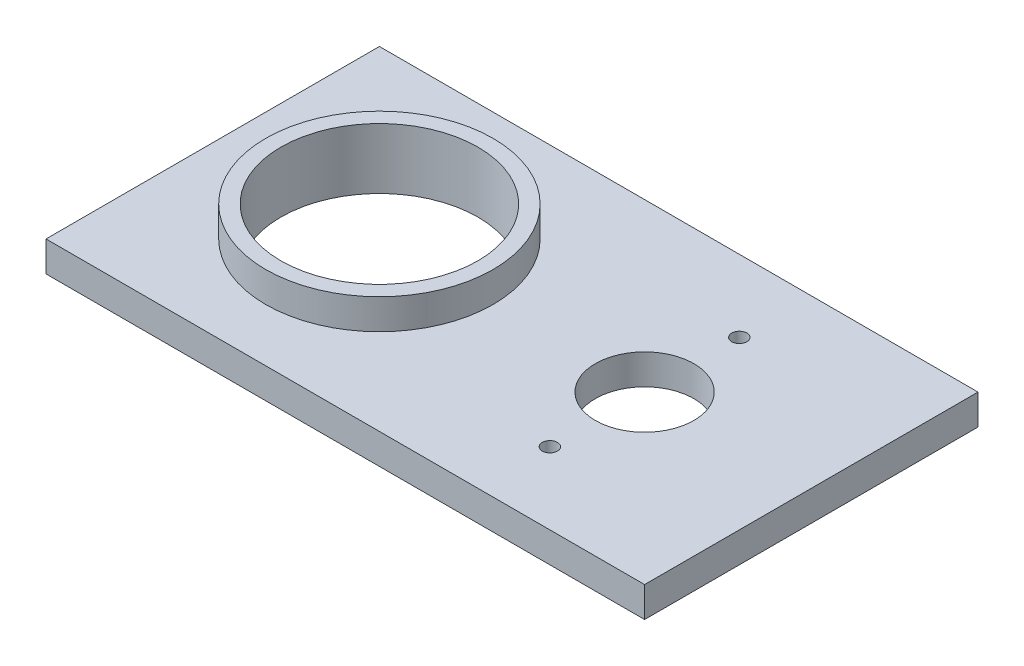
ISO-10303-21;
HEADER;
FILE_DESCRIPTION(('STEP AP214'),'2;1');
FILE_NAME('part.step','',(''),(''),'','','');
FILE_SCHEMA(('AUTOMOTIVE_DESIGN { 1 0 10303 214 1 1 1 1 }'));
ENDSEC;
DATA;
#1=APPLICATION_CONTEXT('core data for automotive mechanical design processes');
#2=APPLICATION_PROTOCOL_DEFINITION('international standard','automotive_design',2000,#1);
#3=PRODUCT_CONTEXT('',#1,'mechanical');
#4=PRODUCT('Part','Part','',(#3));
#5=PRODUCT_RELATED_PRODUCT_CATEGORY('part','',(#4));
#6=PRODUCT_DEFINITION_FORMATION('','',#4);
#7=PRODUCT_DEFINITION_CONTEXT('part definition',#1,'design');
#8=PRODUCT_DEFINITION('design','',#6,#7);
#9=PRODUCT_DEFINITION_SHAPE('','',#8);
#10=(LENGTH_UNIT() NAMED_UNIT(*) SI_UNIT(.MILLI.,.METRE.));
#11=(NAMED_UNIT(*) PLANE_ANGLE_UNIT() SI_UNIT($,.RADIAN.));
#12=(NAMED_UNIT(*) SI_UNIT($,.STERADIAN.) SOLID_ANGLE_UNIT());
#13=UNCERTAINTY_MEASURE_WITH_UNIT(LENGTH_MEASURE(1.E-05),#10,'distance_accuracy_value','');
#14=(GEOMETRIC_REPRESENTATION_CONTEXT(3) GLOBAL_UNCERTAINTY_ASSIGNED_CONTEXT((#13)) GLOBAL_UNIT_ASSIGNED_CONTEXT((#10,
#11,#12)) REPRESENTATION_CONTEXT('',''));
#15=CARTESIAN_POINT('',(0.,0.,0.));
#16=DIRECTION('',(0.,0.,1.));
#17=DIRECTION('',(1.,0.,0.));
#18=AXIS2_PLACEMENT_3D('',#15,#16,#17);
#19=CARTESIAN_POINT('',(0.,4.,0.));
#20=DIRECTION('',(0.,-1.,0.));
#21=DIRECTION('',(0.,0.,-1.));
#22=AXIS2_PLACEMENT_3D('',#19,#20,#21);
#23=PLANE('',#22);
#24=CARTESIAN_POINT('',(0.,4.,12.5));
#25=DIRECTION('',(0.,1.,0.));
#26=DIRECTION('',(0.,0.,1.));
#27=AXIS2_PLACEMENT_3D('',#24,#25,#26);
#28=CIRCLE('',#27,1.);
#29=CARTESIAN_POINT('',(0.,4.,13.5));
#30=VERTEX_POINT('',#29);
#31=EDGE_CURVE('E134',#30,#30,#28,.T.);
#32=ORIENTED_EDGE('',*,*,#31,.F.);
#33=EDGE_LOOP('',(#32));
#34=FACE_BOUND('',#33,.T.);
#35=CARTESIAN_POINT('',(0.,4.,-12.5));
#36=DIRECTION('',(0.,1.,0.));
#37=DIRECTION('',(0.,0.,1.));
#38=AXIS2_PLACEMENT_3D('',#35,#36,#37);
#39=CIRCLE('',#38,1.);
#40=CARTESIAN_POINT('',(0.,4.,-11.5));
#41=VERTEX_POINT('',#40);
#42=EDGE_CURVE('E143',#41,#41,#39,.T.);
#43=ORIENTED_EDGE('',*,*,#42,.F.);
#44=EDGE_LOOP('',(#43));
#45=FACE_BOUND('',#44,.T.);
#46=CARTESIAN_POINT('',(0.,4.,0.));
#47=DIRECTION('',(0.,1.,0.));
#48=DIRECTION('',(0.,0.,1.));
#49=AXIS2_PLACEMENT_3D('',#46,#47,#48);
#50=CIRCLE('',#49,6.5);
#51=CARTESIAN_POINT('',(0.,4.,6.5));
#52=VERTEX_POINT('',#51);
#53=EDGE_CURVE('E109',#52,#52,#50,.T.);
#54=ORIENTED_EDGE('',*,*,#53,.F.);
#55=EDGE_LOOP('',(#54));
#56=FACE_BOUND('',#55,.T.);
#57=DIRECTION('',(0.,0.,-1.));
#58=VECTOR('',#57,1.);
#59=CARTESIAN_POINT('',(22.,4.,22.));
#60=LINE('',#59,#58);
#61=CARTESIAN_POINT('',(22.,4.,22.));
#62=VERTEX_POINT('',#61);
#63=CARTESIAN_POINT('',(22.,4.,-22.));
#64=VERTEX_POINT('',#63);
#65=EDGE_CURVE('E92',#62,#64,#60,.T.);
#66=ORIENTED_EDGE('',*,*,#65,.T.);
#67=DIRECTION('',(-1.,0.,0.));
#68=VECTOR('',#67,1.);
#69=CARTESIAN_POINT('',(-57.,4.,-22.));
#70=LINE('',#69,#68);
#71=CARTESIAN_POINT('',(-57.,4.,-22.));
#72=VERTEX_POINT('',#71);
#73=EDGE_CURVE('E87',#64,#72,#70,.T.);
#74=ORIENTED_EDGE('',*,*,#73,.T.);
#75=DIRECTION('',(0.,0.,1.));
#76=VECTOR('',#75,1.);
#77=CARTESIAN_POINT('',(-57.,4.,22.));
#78=LINE('',#77,#76);
#79=CARTESIAN_POINT('',(-57.,4.,22.));
#80=VERTEX_POINT('',#79);
#81=EDGE_CURVE('E90',#72,#80,#78,.T.);
#82=ORIENTED_EDGE('',*,*,#81,.T.);
#83=DIRECTION('',(1.,0.,0.));
#84=VECTOR('',#83,1.);
#85=CARTESIAN_POINT('',(-57.,4.,22.));
#86=LINE('',#85,#84);
#87=EDGE_CURVE('E56',#80,#62,#86,.T.);
#88=ORIENTED_EDGE('',*,*,#87,.T.);
#89=EDGE_LOOP('',(#66,#74,#82,#88));
#90=FACE_BOUND('',#89,.T.);
#91=CARTESIAN_POINT('',(-35.,4.,0.));
#92=DIRECTION('',(0.,-1.,0.));
#93=DIRECTION('',(0.,0.,-1.));
#94=AXIS2_PLACEMENT_3D('',#91,#92,#93);
#95=CIRCLE('',#94,15.);
#96=CARTESIAN_POINT('',(-35.,4.,-15.));
#97=VERTEX_POINT('',#96);
#98=EDGE_CURVE('E11',#97,#97,#95,.F.);
#99=ORIENTED_EDGE('',*,*,#98,.F.);
#100=EDGE_LOOP('',(#99));
#101=FACE_BOUND('',#100,.T.);
#102=ADVANCED_FACE('F39',(#34,#45,#56,#90,#101),#23,.F.);
#103=CARTESIAN_POINT('',(0.,0.,0.));
#104=DIRECTION('',(0.,-1.,0.));
#105=DIRECTION('',(0.,0.,-1.));
#106=AXIS2_PLACEMENT_3D('',#103,#104,#105);
#107=PLANE('',#106);
#108=CARTESIAN_POINT('',(0.,0.,12.5));
#109=DIRECTION('',(0.,1.,0.));
#110=DIRECTION('',(0.,0.,1.));
#111=AXIS2_PLACEMENT_3D('',#108,#109,#110);
#112=CIRCLE('',#111,1.);
#113=CARTESIAN_POINT('',(0.,0.,13.5));
#114=VERTEX_POINT('',#113);
#115=EDGE_CURVE('E130',#114,#114,#112,.T.);
#116=ORIENTED_EDGE('',*,*,#115,.T.);
#117=EDGE_LOOP('',(#116));
#118=FACE_BOUND('',#117,.T.);
#119=CARTESIAN_POINT('',(0.,0.,0.));
#120=DIRECTION('',(0.,1.,0.));
#121=DIRECTION('',(0.,0.,1.));
#122=AXIS2_PLACEMENT_3D('',#119,#120,#121);
#123=CIRCLE('',#122,6.5);
#124=CARTESIAN_POINT('',(0.,0.,6.5));
#125=VERTEX_POINT('',#124);
#126=EDGE_CURVE('E146',#125,#125,#123,.T.);
#127=ORIENTED_EDGE('',*,*,#126,.T.);
#128=EDGE_LOOP('',(#127));
#129=FACE_BOUND('',#128,.T.);
#130=DIRECTION('',(0.,0.,-1.));
#131=VECTOR('',#130,1.);
#132=CARTESIAN_POINT('',(22.,0.,22.));
#133=LINE('',#132,#131);
#134=CARTESIAN_POINT('',(22.,0.,22.));
#135=VERTEX_POINT('',#134);
#136=CARTESIAN_POINT('',(22.,0.,-22.));
#137=VERTEX_POINT('',#136);
#138=EDGE_CURVE('E106',#135,#137,#133,.T.);
#139=ORIENTED_EDGE('',*,*,#138,.F.);
#140=DIRECTION('',(1.,0.,0.));
#141=VECTOR('',#140,1.);
#142=CARTESIAN_POINT('',(-57.,0.,22.));
#143=LINE('',#142,#141);
#144=CARTESIAN_POINT('',(-57.,0.,22.));
#145=VERTEX_POINT('',#144);
#146=EDGE_CURVE('E79',#145,#135,#143,.T.);
#147=ORIENTED_EDGE('',*,*,#146,.F.);
#148=DIRECTION('',(0.,0.,1.));
#149=VECTOR('',#148,1.);
#150=CARTESIAN_POINT('',(-57.,0.,22.));
#151=LINE('',#150,#149);
#152=CARTESIAN_POINT('',(-57.,0.,-22.));
#153=VERTEX_POINT('',#152);
#154=EDGE_CURVE('E73',#153,#145,#151,.T.);
#155=ORIENTED_EDGE('',*,*,#154,.F.);
#156=DIRECTION('',(-1.,0.,0.));
#157=VECTOR('',#156,1.);
#158=CARTESIAN_POINT('',(-57.,0.,-22.));
#159=LINE('',#158,#157);
#160=EDGE_CURVE('E97',#137,#153,#159,.T.);
#161=ORIENTED_EDGE('',*,*,#160,.F.);
#162=EDGE_LOOP('',(#139,#147,#155,#161));
#163=FACE_BOUND('',#162,.T.);
#164=CARTESIAN_POINT('',(0.,0.,-12.5));
#165=DIRECTION('',(0.,1.,0.));
#166=DIRECTION('',(0.,0.,1.));
#167=AXIS2_PLACEMENT_3D('',#164,#165,#166);
#168=CIRCLE('',#167,1.);
#169=CARTESIAN_POINT('',(0.,0.,-11.5));
#170=VERTEX_POINT('',#169);
#171=EDGE_CURVE('E125',#170,#170,#168,.T.);
#172=ORIENTED_EDGE('',*,*,#171,.T.);
#173=EDGE_LOOP('',(#172));
#174=FACE_BOUND('',#173,.T.);
#175=CARTESIAN_POINT('',(-35.,0.,0.));
#176=DIRECTION('',(0.,1.,0.));
#177=DIRECTION('',(0.,0.,1.));
#178=AXIS2_PLACEMENT_3D('',#175,#176,#177);
#179=CIRCLE('',#178,13.);
#180=CARTESIAN_POINT('',(-35.,0.,13.));
#181=VERTEX_POINT('',#180);
#182=EDGE_CURVE('E128',#181,#181,#179,.T.);
#183=ORIENTED_EDGE('',*,*,#182,.T.);
#184=EDGE_LOOP('',(#183));
#185=FACE_BOUND('',#184,.T.);
#186=ADVANCED_FACE('F117',(#118,#129,#163,#174,#185),#107,.T.);
#187=CARTESIAN_POINT('',(22.,4.,22.));
#188=DIRECTION('',(-1.,0.,0.));
#189=DIRECTION('',(0.,0.,1.));
#190=AXIS2_PLACEMENT_3D('',#187,#188,#189);
#191=PLANE('',#190);
#192=ORIENTED_EDGE('',*,*,#138,.T.);
#193=DIRECTION('',(0.,-1.,0.));
#194=VECTOR('',#193,1.);
#195=CARTESIAN_POINT('',(22.,4.,-22.));
#196=LINE('',#195,#194);
#197=EDGE_CURVE('E48',#64,#137,#196,.T.);
#198=ORIENTED_EDGE('',*,*,#197,.F.);
#199=ORIENTED_EDGE('',*,*,#65,.F.);
#200=DIRECTION('',(0.,-1.,0.));
#201=VECTOR('',#200,1.);
#202=CARTESIAN_POINT('',(22.,4.,22.));
#203=LINE('',#202,#201);
#204=EDGE_CURVE('E102',#62,#135,#203,.T.);
#205=ORIENTED_EDGE('',*,*,#204,.T.);
#206=EDGE_LOOP('',(#192,#198,#199,#205));
#207=FACE_BOUND('',#206,.T.);
#208=ADVANCED_FACE('F41',(#207),#191,.F.);
#209=CARTESIAN_POINT('',(-57.,4.,-22.));
#210=DIRECTION('',(0.,0.,1.));
#211=DIRECTION('',(1.,0.,0.));
#212=AXIS2_PLACEMENT_3D('',#209,#210,#211);
#213=PLANE('',#212);
#214=ORIENTED_EDGE('',*,*,#160,.T.);
#215=DIRECTION('',(0.,-1.,0.));
#216=VECTOR('',#215,1.);
#217=CARTESIAN_POINT('',(-57.,4.,-22.));
#218=LINE('',#217,#216);
#219=EDGE_CURVE('E95',#72,#153,#218,.T.);
#220=ORIENTED_EDGE('',*,*,#219,.F.);
#221=ORIENTED_EDGE('',*,*,#73,.F.);
#222=ORIENTED_EDGE('',*,*,#197,.T.);
#223=EDGE_LOOP('',(#214,#220,#221,#222));
#224=FACE_BOUND('',#223,.T.);
#225=ADVANCED_FACE('F96',(#224),#213,.F.);
#226=CARTESIAN_POINT('',(-57.,4.,22.));
#227=DIRECTION('',(1.,0.,0.));
#228=DIRECTION('',(0.,0.,-1.));
#229=AXIS2_PLACEMENT_3D('',#226,#227,#228);
#230=PLANE('',#229);
#231=ORIENTED_EDGE('',*,*,#154,.T.);
#232=DIRECTION('',(0.,-1.,0.));
#233=VECTOR('',#232,1.);
#234=CARTESIAN_POINT('',(-57.,4.,22.));
#235=LINE('',#234,#233);
#236=EDGE_CURVE('E98',#80,#145,#235,.T.);
#237=ORIENTED_EDGE('',*,*,#236,.F.);
#238=ORIENTED_EDGE('',*,*,#81,.F.);
#239=ORIENTED_EDGE('',*,*,#219,.T.);
#240=EDGE_LOOP('',(#231,#237,#238,#239));
#241=FACE_BOUND('',#240,.T.);
#242=ADVANCED_FACE('F100',(#241),#230,.F.);
#243=CARTESIAN_POINT('',(-57.,4.,22.));
#244=DIRECTION('',(0.,0.,-1.));
#245=DIRECTION('',(-1.,0.,0.));
#246=AXIS2_PLACEMENT_3D('',#243,#244,#245);
#247=PLANE('',#246);
#248=ORIENTED_EDGE('',*,*,#146,.T.);
#249=ORIENTED_EDGE('',*,*,#204,.F.);
#250=ORIENTED_EDGE('',*,*,#87,.F.);
#251=ORIENTED_EDGE('',*,*,#236,.T.);
#252=EDGE_LOOP('',(#248,#249,#250,#251));
#253=FACE_BOUND('',#252,.T.);
#254=ADVANCED_FACE('F157',(#253),#247,.F.);
#255=CARTESIAN_POINT('',(0.,4.,0.));
#256=DIRECTION('',(0.,-1.,0.));
#257=DIRECTION('',(0.,0.,-1.));
#258=AXIS2_PLACEMENT_3D('',#255,#256,#257);
#259=CYLINDRICAL_SURFACE('',#258,6.5);
#260=ORIENTED_EDGE('',*,*,#53,.T.);
#261=EDGE_LOOP('',(#260));
#262=FACE_BOUND('',#261,.T.);
#263=ORIENTED_EDGE('',*,*,#126,.F.);
#264=EDGE_LOOP('',(#263));
#265=FACE_BOUND('',#264,.T.);
#266=ADVANCED_FACE('F154',(#262,#265),#259,.F.);
#267=CARTESIAN_POINT('',(0.,4.,-12.5));
#268=DIRECTION('',(0.,-1.,0.));
#269=DIRECTION('',(0.,0.,-1.));
#270=AXIS2_PLACEMENT_3D('',#267,#268,#269);
#271=CYLINDRICAL_SURFACE('',#270,1.);
#272=ORIENTED_EDGE('',*,*,#42,.T.);
#273=EDGE_LOOP('',(#272));
#274=FACE_BOUND('',#273,.T.);
#275=ORIENTED_EDGE('',*,*,#171,.F.);
#276=EDGE_LOOP('',(#275));
#277=FACE_BOUND('',#276,.T.);
#278=ADVANCED_FACE('F156',(#274,#277),#271,.F.);
#279=CARTESIAN_POINT('',(0.,4.,12.5));
#280=DIRECTION('',(0.,-1.,0.));
#281=DIRECTION('',(0.,0.,-1.));
#282=AXIS2_PLACEMENT_3D('',#279,#280,#281);
#283=CYLINDRICAL_SURFACE('',#282,1.);
#284=ORIENTED_EDGE('',*,*,#31,.T.);
#285=EDGE_LOOP('',(#284));
#286=FACE_BOUND('',#285,.T.);
#287=ORIENTED_EDGE('',*,*,#115,.F.);
#288=EDGE_LOOP('',(#287));
#289=FACE_BOUND('',#288,.T.);
#290=ADVANCED_FACE('F164',(#286,#289),#283,.F.);
#291=CARTESIAN_POINT('',(-35.,4.,0.));
#292=DIRECTION('',(0.,-1.,0.));
#293=DIRECTION('',(0.,0.,-1.));
#294=AXIS2_PLACEMENT_3D('',#291,#292,#293);
#295=CYLINDRICAL_SURFACE('',#294,13.);
#296=ORIENTED_EDGE('',*,*,#182,.F.);
#297=EDGE_LOOP('',(#296));
#298=FACE_BOUND('',#297,.T.);
#299=CARTESIAN_POINT('',(-35.,8.,0.));
#300=DIRECTION('',(0.,1.,0.));
#301=DIRECTION('',(0.,0.,1.));
#302=AXIS2_PLACEMENT_3D('',#299,#300,#301);
#303=CIRCLE('',#302,13.);
#304=CARTESIAN_POINT('',(-35.,8.,13.));
#305=VERTEX_POINT('',#304);
#306=EDGE_CURVE('E137',#305,#305,#303,.T.);
#307=ORIENTED_EDGE('',*,*,#306,.T.);
#308=EDGE_LOOP('',(#307));
#309=FACE_BOUND('',#308,.T.);
#310=ADVANCED_FACE('F222',(#298,#309),#295,.F.);
#311=CARTESIAN_POINT('',(-35.,8.,0.));
#312=DIRECTION('',(0.,1.,0.));
#313=DIRECTION('',(0.,0.,1.));
#314=AXIS2_PLACEMENT_3D('',#311,#312,#313);
#315=PLANE('',#314);
#316=CARTESIAN_POINT('',(-35.,8.,0.));
#317=DIRECTION('',(0.,1.,0.));
#318=DIRECTION('',(0.,0.,1.));
#319=AXIS2_PLACEMENT_3D('',#316,#317,#318);
#320=CIRCLE('',#319,15.);
#321=CARTESIAN_POINT('',(-35.,8.,15.));
#322=VERTEX_POINT('',#321);
#323=EDGE_CURVE('E131',#322,#322,#320,.T.);
#324=ORIENTED_EDGE('',*,*,#323,.T.);
#325=EDGE_LOOP('',(#324));
#326=FACE_BOUND('',#325,.T.);
#327=ORIENTED_EDGE('',*,*,#306,.F.);
#328=EDGE_LOOP('',(#327));
#329=FACE_BOUND('',#328,.T.);
#330=ADVANCED_FACE('F229',(#326,#329),#315,.T.);
#331=CARTESIAN_POINT('',(-35.,8.,0.));
#332=DIRECTION('',(0.,-1.,0.));
#333=DIRECTION('',(0.,0.,-1.));
#334=AXIS2_PLACEMENT_3D('',#331,#332,#333);
#335=CYLINDRICAL_SURFACE('',#334,15.);
#336=ORIENTED_EDGE('',*,*,#323,.F.);
#337=EDGE_LOOP('',(#336));
#338=FACE_BOUND('',#337,.T.);
#339=ORIENTED_EDGE('',*,*,#98,.T.);
#340=EDGE_LOOP('',(#339));
#341=FACE_BOUND('',#340,.T.);
#342=ADVANCED_FACE('F243',(#338,#341),#335,.T.);
#343=CLOSED_SHELL('',(#102,#186,#208,#225,#242,#254,#266,#278,#290,#310,#330,#342));
#344=MANIFOLD_SOLID_BREP('B2',#343);
#345=ADVANCED_BREP_SHAPE_REPRESENTATION('',(#18,#344),#14);
#346=SHAPE_DEFINITION_REPRESENTATION(#9,#345);
ENDSEC;
END-ISO-10303-21;
